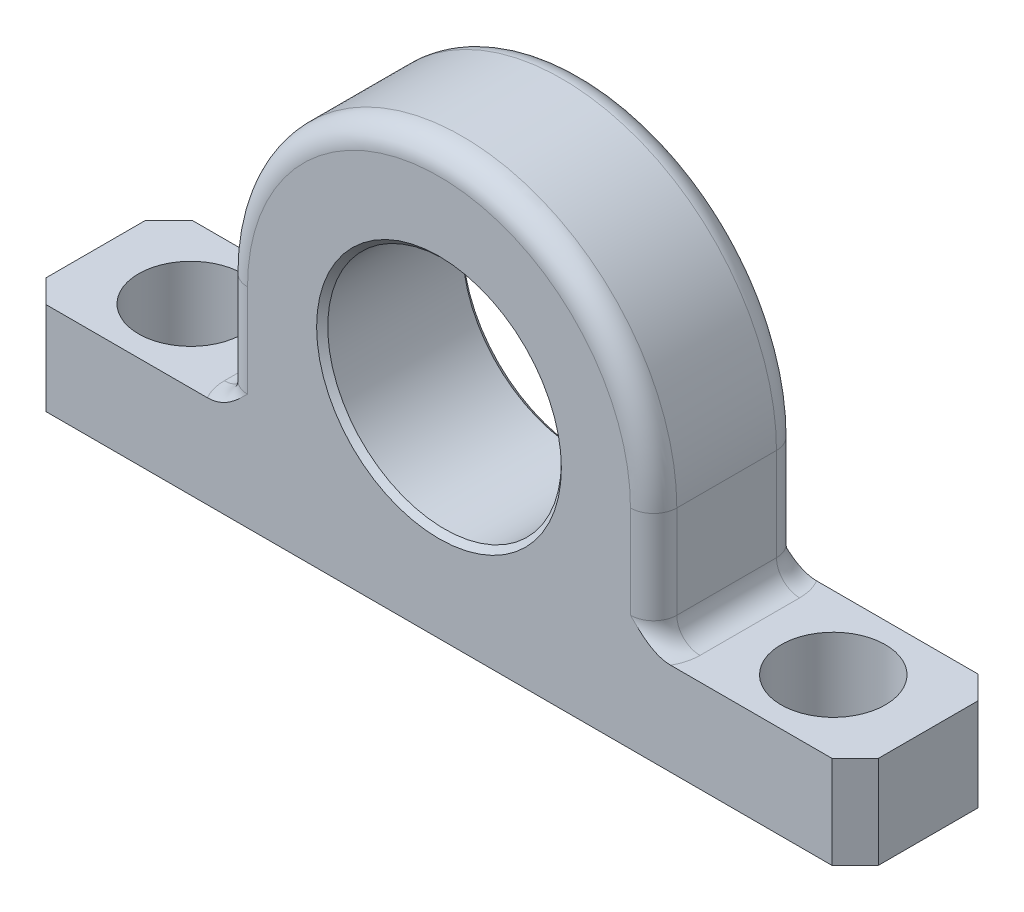
ISO-10303-21;
HEADER;
FILE_DESCRIPTION(('STEP AP214'),'2;1');
FILE_NAME('part.step','',(''),(''),'','','');
FILE_SCHEMA(('AUTOMOTIVE_DESIGN { 1 0 10303 214 1 1 1 1 }'));
ENDSEC;
DATA;
#1=APPLICATION_CONTEXT('core data for automotive mechanical design processes');
#2=APPLICATION_PROTOCOL_DEFINITION('international standard','automotive_design',2000,#1);
#3=PRODUCT_CONTEXT('',#1,'mechanical');
#4=PRODUCT('Part','Part','',(#3));
#5=PRODUCT_RELATED_PRODUCT_CATEGORY('part','',(#4));
#6=PRODUCT_DEFINITION_FORMATION('','',#4);
#7=PRODUCT_DEFINITION_CONTEXT('part definition',#1,'design');
#8=PRODUCT_DEFINITION('design','',#6,#7);
#9=PRODUCT_DEFINITION_SHAPE('','',#8);
#10=(LENGTH_UNIT() NAMED_UNIT(*) SI_UNIT(.MILLI.,.METRE.));
#11=(NAMED_UNIT(*) PLANE_ANGLE_UNIT() SI_UNIT($,.RADIAN.));
#12=(NAMED_UNIT(*) SI_UNIT($,.STERADIAN.) SOLID_ANGLE_UNIT());
#13=UNCERTAINTY_MEASURE_WITH_UNIT(LENGTH_MEASURE(1.E-05),#10,'distance_accuracy_value','');
#14=(GEOMETRIC_REPRESENTATION_CONTEXT(3) GLOBAL_UNCERTAINTY_ASSIGNED_CONTEXT((#13)) GLOBAL_UNIT_ASSIGNED_CONTEXT((#10,
#11,#12)) REPRESENTATION_CONTEXT('',''));
#15=CARTESIAN_POINT('',(0.,0.,0.));
#16=DIRECTION('',(0.,0.,1.));
#17=DIRECTION('',(1.,0.,0.));
#18=AXIS2_PLACEMENT_3D('',#15,#16,#17);
#19=CARTESIAN_POINT('',(0.,14.3,5.));
#20=DIRECTION('',(0.,0.,1.));
#21=DIRECTION('',(1.,0.,0.));
#22=AXIS2_PLACEMENT_3D('',#19,#20,#21);
#23=PLANE('',#22);
#24=CARTESIAN_POINT('',(0.,14.3,5.));
#25=DIRECTION('',(0.,0.,1.));
#26=DIRECTION('',(1.,0.,0.));
#27=AXIS2_PLACEMENT_3D('',#24,#25,#26);
#28=CIRCLE('',#27,8.38100000000001);
#29=CARTESIAN_POINT('',(8.38100000000001,14.3,5.));
#30=VERTEX_POINT('',#29);
#31=EDGE_CURVE('E12',#30,#30,#28,.F.);
#32=ORIENTED_EDGE('',*,*,#31,.T.);
#33=EDGE_LOOP('',(#32));
#34=FACE_BOUND('',#33,.T.);
#35=DIRECTION('',(1.,0.,0.));
#36=VECTOR('',#35,1.);
#37=CARTESIAN_POINT('',(-28.5,0.,5.));
#38=LINE('',#37,#36);
#39=CARTESIAN_POINT('',(-26.9125,0.,5.));
#40=VERTEX_POINT('',#39);
#41=CARTESIAN_POINT('',(26.9125,0.,5.));
#42=VERTEX_POINT('',#41);
#43=EDGE_CURVE('E605',#40,#42,#38,.T.);
#44=ORIENTED_EDGE('',*,*,#43,.T.);
#45=DIRECTION('',(0.,1.,0.));
#46=VECTOR('',#45,1.);
#47=CARTESIAN_POINT('',(26.9125,6.35000000000001,5.));
#48=LINE('',#47,#46);
#49=CARTESIAN_POINT('',(26.9125,6.35000000000001,5.));
#50=VERTEX_POINT('',#49);
#51=EDGE_CURVE('E685',#42,#50,#48,.T.);
#52=ORIENTED_EDGE('',*,*,#51,.T.);
#53=DIRECTION('',(-1.,0.,0.));
#54=VECTOR('',#53,1.);
#55=CARTESIAN_POINT('',(28.5,6.35000000000001,5.));
#56=LINE('',#55,#54);
#57=CARTESIAN_POINT('',(15.8621306570156,6.35,5.));
#58=VERTEX_POINT('',#57);
#59=EDGE_CURVE('E608',#50,#58,#56,.T.);
#60=ORIENTED_EDGE('',*,*,#59,.T.);
#61=CARTESIAN_POINT('',(15.8621306570156,6.35,5.));
#62=CARTESIAN_POINT('',(15.794097486566,6.34999554933561,5.));
#63=CARTESIAN_POINT('',(15.7261228508442,6.35327982071229,5.));
#64=CARTESIAN_POINT('',(15.5908485896682,6.36598925393127,5.));
#65=CARTESIAN_POINT('',(15.5235480949814,6.37540507054521,5.));
#66=CARTESIAN_POINT('',(15.3248608747615,6.41190441990164,5.));
#67=CARTESIAN_POINT('',(15.1949579488796,6.44726316471159,5.));
#68=CARTESIAN_POINT('',(14.8946937292162,6.55304335959927,5.));
#69=CARTESIAN_POINT('',(14.7272685715575,6.63161663326229,5.));
#70=CARTESIAN_POINT('',(14.4061687820012,6.81403388554132,5.));
#71=CARTESIAN_POINT('',(14.2525762438165,6.91801666675492,5.));
#72=CARTESIAN_POINT('',(13.9277540091234,7.1652642515428,5.));
#73=CARTESIAN_POINT('',(13.7594109868458,7.31220837636742,5.));
#74=CARTESIAN_POINT('',(13.4334074538243,7.61671176311661,5.));
#75=CARTESIAN_POINT('',(13.2757387302991,7.77426267368925,5.));
#76=CARTESIAN_POINT('',(13.1162564755506,7.93374352567541,5.));
#77=CARTESIAN_POINT('',(13.1143782375845,7.93562176365669,5.));
#78=CARTESIAN_POINT('',(13.1125,7.93750000000001,5.));
#79=B_SPLINE_CURVE_WITH_KNOTS('',3,(#61,#62,#63,#64,#65,#66,#67,#68,#69,#70,#71,#72,#73,#74,#75,
#76,#77,#78),.UNSPECIFIED.,.F.,.F.,(4,2,2,2,2,2,2,2,4),(0.,0.20392435013509,0.407538619655304,
0.809647512230969,1.36141360837506,1.91626395535248,2.58543870518178,3.25409260056162,
3.26206128928693),.UNSPECIFIED.);
#80=CARTESIAN_POINT('',(13.1125,7.93750000000001,5.));
#81=VERTEX_POINT('',#80);
#82=EDGE_CURVE('E313',#58,#81,#79,.T.);
#83=ORIENTED_EDGE('',*,*,#82,.T.);
#84=DIRECTION('',(0.,1.,0.));
#85=VECTOR('',#84,1.);
#86=CARTESIAN_POINT('',(13.1125,14.3,5.));
#87=LINE('',#86,#85);
#88=CARTESIAN_POINT('',(13.1125,14.3,5.));
#89=VERTEX_POINT('',#88);
#90=EDGE_CURVE('E273',#81,#89,#87,.T.);
#91=ORIENTED_EDGE('',*,*,#90,.T.);
#92=CARTESIAN_POINT('',(0.,14.3,5.));
#93=DIRECTION('',(0.,0.,1.));
#94=DIRECTION('',(1.,0.,0.));
#95=AXIS2_PLACEMENT_3D('',#92,#93,#94);
#96=CIRCLE('',#95,13.1125);
#97=CARTESIAN_POINT('',(-13.1125,14.3,5.));
#98=VERTEX_POINT('',#97);
#99=EDGE_CURVE('E271',#89,#98,#96,.T.);
#100=ORIENTED_EDGE('',*,*,#99,.T.);
#101=DIRECTION('',(0.,-1.,0.));
#102=VECTOR('',#101,1.);
#103=CARTESIAN_POINT('',(-13.1125,6.35,5.));
#104=LINE('',#103,#102);
#105=CARTESIAN_POINT('',(-13.1125,7.9375,5.));
#106=VERTEX_POINT('',#105);
#107=EDGE_CURVE('E254',#98,#106,#104,.T.);
#108=ORIENTED_EDGE('',*,*,#107,.T.);
#109=CARTESIAN_POINT('',(-15.8621306570156,6.35,5.));
#110=CARTESIAN_POINT('',(-15.794097486566,6.3499955493356,5.));
#111=CARTESIAN_POINT('',(-15.7261228508442,6.35327982071229,5.));
#112=CARTESIAN_POINT('',(-15.5908485896682,6.36598925393126,5.));
#113=CARTESIAN_POINT('',(-15.5235480949814,6.3754050705452,5.));
#114=CARTESIAN_POINT('',(-15.3248608747615,6.41190441990164,5.));
#115=CARTESIAN_POINT('',(-15.1949579488796,6.44726316471159,5.));
#116=CARTESIAN_POINT('',(-14.8946937292162,6.55304335959926,5.));
#117=CARTESIAN_POINT('',(-14.7272685715575,6.63161663326228,5.));
#118=CARTESIAN_POINT('',(-14.4061687820012,6.81403388554132,5.));
#119=CARTESIAN_POINT('',(-14.2525762438165,6.91801666675491,5.));
#120=CARTESIAN_POINT('',(-13.9277540091234,7.1652642515428,5.));
#121=CARTESIAN_POINT('',(-13.7594109868458,7.31220837636741,5.));
#122=CARTESIAN_POINT('',(-13.4334074538243,7.6167117631166,5.));
#123=CARTESIAN_POINT('',(-13.2757387302991,7.77426267368925,5.));
#124=CARTESIAN_POINT('',(-13.1162564755506,7.9337435256754,5.));
#125=CARTESIAN_POINT('',(-13.1143782375845,7.93562176365669,5.));
#126=CARTESIAN_POINT('',(-13.1125,7.9375,5.));
#127=B_SPLINE_CURVE_WITH_KNOTS('',3,(#109,#110,#111,#112,#113,#114,#115,#116,#117,#118,#119,
#120,#121,#122,#123,#124,#125,#126),.UNSPECIFIED.,.F.,.F.,(4,2,2,2,2,2,2,2,4),(0.,
0.203924350135094,0.407538619655304,0.809647512230969,1.36141360837506,1.91626395535248,
2.58543870518178,3.25409260056162,3.26206128928693),.UNSPECIFIED.);
#128=CARTESIAN_POINT('',(-15.8621306570156,6.35,5.));
#129=VERTEX_POINT('',#128);
#130=EDGE_CURVE('E341',#106,#129,#127,.F.);
#131=ORIENTED_EDGE('',*,*,#130,.T.);
#132=DIRECTION('',(-1.,0.,0.));
#133=VECTOR('',#132,1.);
#134=CARTESIAN_POINT('',(-28.5,6.35,5.));
#135=LINE('',#134,#133);
#136=CARTESIAN_POINT('',(-26.9125,6.35,5.));
#137=VERTEX_POINT('',#136);
#138=EDGE_CURVE('E611',#129,#137,#135,.T.);
#139=ORIENTED_EDGE('',*,*,#138,.T.);
#140=DIRECTION('',(0.,-1.,0.));
#141=VECTOR('',#140,1.);
#142=CARTESIAN_POINT('',(-26.9125,0.,5.));
#143=LINE('',#142,#141);
#144=EDGE_CURVE('E682',#137,#40,#143,.T.);
#145=ORIENTED_EDGE('',*,*,#144,.T.);
#146=EDGE_LOOP('',(#44,#52,#60,#83,#91,#100,#108,#131,#139,#145));
#147=FACE_BOUND('',#146,.T.);
#148=ADVANCED_FACE('F85',(#34,#147),#23,.T.);
#149=CARTESIAN_POINT('',(0.,14.3,-5.));
#150=DIRECTION('',(0.,0.,1.));
#151=DIRECTION('',(1.,0.,0.));
#152=AXIS2_PLACEMENT_3D('',#149,#150,#151);
#153=PLANE('',#152);
#154=CARTESIAN_POINT('',(0.,14.3,-5.));
#155=DIRECTION('',(0.,0.,1.));
#156=DIRECTION('',(1.,0.,0.));
#157=AXIS2_PLACEMENT_3D('',#154,#155,#156);
#158=CIRCLE('',#157,8.38099999999999);
#159=CARTESIAN_POINT('',(8.38099999999999,14.3,-5.));
#160=VERTEX_POINT('',#159);
#161=EDGE_CURVE('E396',#160,#160,#158,.T.);
#162=ORIENTED_EDGE('',*,*,#161,.T.);
#163=EDGE_LOOP('',(#162));
#164=FACE_BOUND('',#163,.T.);
#165=DIRECTION('',(-1.,0.,0.));
#166=VECTOR('',#165,1.);
#167=CARTESIAN_POINT('',(28.5,6.35000000000001,-5.));
#168=LINE('',#167,#166);
#169=CARTESIAN_POINT('',(26.9125,6.35000000000001,-5.));
#170=VERTEX_POINT('',#169);
#171=CARTESIAN_POINT('',(15.8621306570156,6.35,-5.));
#172=VERTEX_POINT('',#171);
#173=EDGE_CURVE('E617',#170,#172,#168,.T.);
#174=ORIENTED_EDGE('',*,*,#173,.F.);
#175=DIRECTION('',(0.,-1.,0.));
#176=VECTOR('',#175,1.);
#177=CARTESIAN_POINT('',(26.9125,14.3,-5.));
#178=LINE('',#177,#176);
#179=CARTESIAN_POINT('',(26.9125,0.,-5.));
#180=VERTEX_POINT('',#179);
#181=EDGE_CURVE('E672',#170,#180,#178,.T.);
#182=ORIENTED_EDGE('',*,*,#181,.T.);
#183=DIRECTION('',(1.,0.,0.));
#184=VECTOR('',#183,1.);
#185=CARTESIAN_POINT('',(-28.5,0.,-5.));
#186=LINE('',#185,#184);
#187=CARTESIAN_POINT('',(-26.9125,0.,-5.));
#188=VERTEX_POINT('',#187);
#189=EDGE_CURVE('E286',#188,#180,#186,.T.);
#190=ORIENTED_EDGE('',*,*,#189,.F.);
#191=DIRECTION('',(0.,1.,0.));
#192=VECTOR('',#191,1.);
#193=CARTESIAN_POINT('',(-26.9125,14.3,-5.));
#194=LINE('',#193,#192);
#195=CARTESIAN_POINT('',(-26.9125,6.35,-5.));
#196=VERTEX_POINT('',#195);
#197=EDGE_CURVE('E670',#188,#196,#194,.T.);
#198=ORIENTED_EDGE('',*,*,#197,.T.);
#199=DIRECTION('',(-1.,0.,0.));
#200=VECTOR('',#199,1.);
#201=CARTESIAN_POINT('',(-28.5,6.35,-5.));
#202=LINE('',#201,#200);
#203=CARTESIAN_POINT('',(-15.8621306570156,6.35,-5.));
#204=VERTEX_POINT('',#203);
#205=EDGE_CURVE('E609',#204,#196,#202,.T.);
#206=ORIENTED_EDGE('',*,*,#205,.F.);
#207=CARTESIAN_POINT('',(-15.8621306570156,6.35,-5.));
#208=CARTESIAN_POINT('',(-15.7940974865659,6.3499955493356,-5.));
#209=CARTESIAN_POINT('',(-15.7261228508441,6.35327982071229,-5.));
#210=CARTESIAN_POINT('',(-15.590848589668,6.36598925393128,-5.));
#211=CARTESIAN_POINT('',(-15.5235480949812,6.37540507054523,-5.));
#212=CARTESIAN_POINT('',(-15.3248608747613,6.41190441990168,-5.));
#213=CARTESIAN_POINT('',(-15.1949579488795,6.44726316471161,-5.));
#214=CARTESIAN_POINT('',(-14.8946937292162,6.55304335959925,-5.));
#215=CARTESIAN_POINT('',(-14.7272685715576,6.63161663326226,-5.));
#216=CARTESIAN_POINT('',(-14.4061687820012,6.81403388554121,-5.));
#217=CARTESIAN_POINT('',(-14.2525762438164,6.91801666675475,-5.));
#218=CARTESIAN_POINT('',(-13.9277540091235,7.16526425154297,-5.));
#219=CARTESIAN_POINT('',(-13.7594109868463,7.31220837636808,-5.));
#220=CARTESIAN_POINT('',(-13.4334074538236,7.61671176311603,-5.));
#221=CARTESIAN_POINT('',(-13.2757387302968,7.77426267368695,-5.));
#222=CARTESIAN_POINT('',(-13.1162564755505,7.93374352567535,-5.));
#223=CARTESIAN_POINT('',(-13.1143782375845,7.93562176365666,-5.));
#224=CARTESIAN_POINT('',(-13.1125,7.9375,-5.));
#225=B_SPLINE_CURVE_WITH_KNOTS('',3,(#207,#208,#209,#210,#211,#212,#213,#214,#215,#216,#217,
#218,#219,#220,#221,#222,#223,#224),.UNSPECIFIED.,.F.,.F.,(4,2,2,2,2,2,2,2,4),(0.,
0.203924350135216,0.407538619655549,0.80964751223097,1.36141360837487,1.91626395535248,
2.58543870518189,3.25409260056162,3.26206128928693),.UNSPECIFIED.);
#226=CARTESIAN_POINT('',(-13.1125,7.9375,-5.));
#227=VERTEX_POINT('',#226);
#228=EDGE_CURVE('E347',#204,#227,#225,.T.);
#229=ORIENTED_EDGE('',*,*,#228,.T.);
#230=DIRECTION('',(0.,-1.,0.));
#231=VECTOR('',#230,1.);
#232=CARTESIAN_POINT('',(-13.1125,14.3,-5.));
#233=LINE('',#232,#231);
#234=CARTESIAN_POINT('',(-13.1125,14.3,-5.));
#235=VERTEX_POINT('',#234);
#236=EDGE_CURVE('E263',#227,#235,#233,.F.);
#237=ORIENTED_EDGE('',*,*,#236,.T.);
#238=CARTESIAN_POINT('',(0.,14.3,-5.));
#239=DIRECTION('',(0.,0.,1.));
#240=DIRECTION('',(1.,0.,0.));
#241=AXIS2_PLACEMENT_3D('',#238,#239,#240);
#242=CIRCLE('',#241,13.1125);
#243=CARTESIAN_POINT('',(13.1125,14.3,-5.));
#244=VERTEX_POINT('',#243);
#245=EDGE_CURVE('E266',#235,#244,#242,.F.);
#246=ORIENTED_EDGE('',*,*,#245,.T.);
#247=DIRECTION('',(0.,1.,0.));
#248=VECTOR('',#247,1.);
#249=CARTESIAN_POINT('',(13.1125,14.3,-5.));
#250=LINE('',#249,#248);
#251=CARTESIAN_POINT('',(13.1125,7.93750000000001,-5.));
#252=VERTEX_POINT('',#251);
#253=EDGE_CURVE('E630',#244,#252,#250,.F.);
#254=ORIENTED_EDGE('',*,*,#253,.T.);
#255=CARTESIAN_POINT('',(15.8621306570156,6.35,-5.));
#256=CARTESIAN_POINT('',(15.7940974865659,6.3499955493356,-5.));
#257=CARTESIAN_POINT('',(15.7261228508441,6.35327982071229,-5.));
#258=CARTESIAN_POINT('',(15.590848589668,6.36598925393129,-5.));
#259=CARTESIAN_POINT('',(15.5235480949812,6.37540507054524,-5.));
#260=CARTESIAN_POINT('',(15.3248608747613,6.41190441990168,-5.));
#261=CARTESIAN_POINT('',(15.1949579488795,6.44726316471161,-5.));
#262=CARTESIAN_POINT('',(14.8946937292162,6.55304335959925,-5.));
#263=CARTESIAN_POINT('',(14.7272685715576,6.63161663326226,-5.));
#264=CARTESIAN_POINT('',(14.4061687820012,6.81403388554122,-5.));
#265=CARTESIAN_POINT('',(14.2525762438164,6.91801666675475,-5.));
#266=CARTESIAN_POINT('',(13.9277540091235,7.16526425154297,-5.));
#267=CARTESIAN_POINT('',(13.7594109868463,7.31220837636808,-5.));
#268=CARTESIAN_POINT('',(13.4334074538236,7.61671176311604,-5.));
#269=CARTESIAN_POINT('',(13.2757387302968,7.77426267368696,-5.));
#270=CARTESIAN_POINT('',(13.1162564755505,7.93374352567535,-5.));
#271=CARTESIAN_POINT('',(13.1143782375845,7.93562176365667,-5.));
#272=CARTESIAN_POINT('',(13.1125,7.93750000000001,-5.));
#273=B_SPLINE_CURVE_WITH_KNOTS('',3,(#255,#256,#257,#258,#259,#260,#261,#262,#263,#264,#265,
#266,#267,#268,#269,#270,#271,#272),.UNSPECIFIED.,.F.,.F.,(4,2,2,2,2,2,2,2,4),(0.,
0.203924350135212,0.407538619655549,0.80964751223097,1.36141360837487,1.91626395535248,
2.58543870518189,3.25409260056162,3.26206128928693),.UNSPECIFIED.);
#274=EDGE_CURVE('E320',#252,#172,#273,.F.);
#275=ORIENTED_EDGE('',*,*,#274,.T.);
#276=EDGE_LOOP('',(#174,#182,#190,#198,#206,#229,#237,#246,#254,#275));
#277=FACE_BOUND('',#276,.T.);
#278=ADVANCED_FACE('F334',(#164,#277),#153,.F.);
#279=CARTESIAN_POINT('',(-28.5,0.,5.));
#280=DIRECTION('',(0.,1.,0.));
#281=DIRECTION('',(-1.,0.,0.));
#282=AXIS2_PLACEMENT_3D('',#279,#280,#281);
#283=PLANE('',#282);
#284=CARTESIAN_POINT('',(-22.,0.,0.));
#285=DIRECTION('',(0.,1.,0.));
#286=DIRECTION('',(-1.,0.,0.));
#287=AXIS2_PLACEMENT_3D('',#284,#285,#286);
#288=CIRCLE('',#287,3.571875);
#289=CARTESIAN_POINT('',(-25.571875,0.,0.));
#290=VERTEX_POINT('',#289);
#291=EDGE_CURVE('E655',#290,#290,#288,.T.);
#292=ORIENTED_EDGE('',*,*,#291,.T.);
#293=EDGE_LOOP('',(#292));
#294=FACE_BOUND('',#293,.T.);
#295=CARTESIAN_POINT('',(22.,0.,0.));
#296=DIRECTION('',(0.,1.,0.));
#297=DIRECTION('',(1.,0.,0.));
#298=AXIS2_PLACEMENT_3D('',#295,#296,#297);
#299=CIRCLE('',#298,3.571875);
#300=CARTESIAN_POINT('',(25.571875,0.,0.));
#301=VERTEX_POINT('',#300);
#302=EDGE_CURVE('E596',#301,#301,#299,.T.);
#303=ORIENTED_EDGE('',*,*,#302,.T.);
#304=EDGE_LOOP('',(#303));
#305=FACE_BOUND('',#304,.T.);
#306=ORIENTED_EDGE('',*,*,#189,.T.);
#307=DIRECTION('',(-0.707106781186549,0.,-0.707106781186546));
#308=VECTOR('',#307,1.);
#309=CARTESIAN_POINT('',(28.5,0.,-3.41250000000001));
#310=LINE('',#309,#308);
#311=CARTESIAN_POINT('',(28.5,0.,-3.41250000000001));
#312=VERTEX_POINT('',#311);
#313=EDGE_CURVE('E680',#180,#312,#310,.F.);
#314=ORIENTED_EDGE('',*,*,#313,.T.);
#315=DIRECTION('',(0.,0.,-1.));
#316=VECTOR('',#315,1.);
#317=CARTESIAN_POINT('',(28.5,0.,5.));
#318=LINE('',#317,#316);
#319=CARTESIAN_POINT('',(28.5,0.,3.41249999999999));
#320=VERTEX_POINT('',#319);
#321=EDGE_CURVE('E236',#320,#312,#318,.T.);
#322=ORIENTED_EDGE('',*,*,#321,.F.);
#323=DIRECTION('',(-0.707106781186546,0.,0.707106781186549));
#324=VECTOR('',#323,1.);
#325=CARTESIAN_POINT('',(26.9125,0.,5.));
#326=LINE('',#325,#324);
#327=EDGE_CURVE('E678',#320,#42,#326,.T.);
#328=ORIENTED_EDGE('',*,*,#327,.T.);
#329=ORIENTED_EDGE('',*,*,#43,.F.);
#330=DIRECTION('',(-0.707106781186546,0.,-0.707106781186549));
#331=VECTOR('',#330,1.);
#332=CARTESIAN_POINT('',(-26.9125,0.,5.));
#333=LINE('',#332,#331);
#334=CARTESIAN_POINT('',(-28.5,0.,3.41249999999999));
#335=VERTEX_POINT('',#334);
#336=EDGE_CURVE('E674',#40,#335,#333,.T.);
#337=ORIENTED_EDGE('',*,*,#336,.T.);
#338=DIRECTION('',(0.,0.,-1.));
#339=VECTOR('',#338,1.);
#340=CARTESIAN_POINT('',(-28.5,0.,5.));
#341=LINE('',#340,#339);
#342=CARTESIAN_POINT('',(-28.5,0.,-3.41250000000001));
#343=VERTEX_POINT('',#342);
#344=EDGE_CURVE('E614',#335,#343,#341,.T.);
#345=ORIENTED_EDGE('',*,*,#344,.T.);
#346=DIRECTION('',(-0.707106781186549,0.,0.707106781186546));
#347=VECTOR('',#346,1.);
#348=CARTESIAN_POINT('',(-28.5,0.,-3.41250000000001));
#349=LINE('',#348,#347);
#350=EDGE_CURVE('E676',#343,#188,#349,.F.);
#351=ORIENTED_EDGE('',*,*,#350,.T.);
#352=EDGE_LOOP('',(#306,#314,#322,#328,#329,#337,#345,#351));
#353=FACE_BOUND('',#352,.T.);
#354=ADVANCED_FACE('F441',(#294,#305,#353),#283,.F.);
#355=CARTESIAN_POINT('',(28.5,0.,5.));
#356=DIRECTION('',(-1.,0.,0.));
#357=DIRECTION('',(0.,0.,1.));
#358=AXIS2_PLACEMENT_3D('',#355,#356,#357);
#359=PLANE('',#358);
#360=ORIENTED_EDGE('',*,*,#321,.T.);
#361=DIRECTION('',(0.,1.,0.));
#362=VECTOR('',#361,1.);
#363=CARTESIAN_POINT('',(28.5,0.,-3.41250000000001));
#364=LINE('',#363,#362);
#365=CARTESIAN_POINT('',(28.5,6.35000000000001,-3.41250000000001));
#366=VERTEX_POINT('',#365);
#367=EDGE_CURVE('E663',#312,#366,#364,.T.);
#368=ORIENTED_EDGE('',*,*,#367,.T.);
#369=DIRECTION('',(0.,0.,-1.));
#370=VECTOR('',#369,1.);
#371=CARTESIAN_POINT('',(28.5,6.35000000000001,5.));
#372=LINE('',#371,#370);
#373=CARTESIAN_POINT('',(28.5,6.35000000000001,3.41249999999999));
#374=VERTEX_POINT('',#373);
#375=EDGE_CURVE('E624',#374,#366,#372,.T.);
#376=ORIENTED_EDGE('',*,*,#375,.F.);
#377=DIRECTION('',(0.,-1.,0.));
#378=VECTOR('',#377,1.);
#379=CARTESIAN_POINT('',(28.5,0.,3.41249999999999));
#380=LINE('',#379,#378);
#381=EDGE_CURVE('E661',#374,#320,#380,.T.);
#382=ORIENTED_EDGE('',*,*,#381,.T.);
#383=EDGE_LOOP('',(#360,#368,#376,#382));
#384=FACE_BOUND('',#383,.T.);
#385=ADVANCED_FACE('F437',(#384),#359,.F.);
#386=CARTESIAN_POINT('',(28.5,6.35000000000001,5.));
#387=DIRECTION('',(0.,-1.,0.));
#388=DIRECTION('',(1.,0.,0.));
#389=AXIS2_PLACEMENT_3D('',#386,#387,#388);
#390=PLANE('',#389);
#391=CARTESIAN_POINT('',(22.,6.35000000000001,0.));
#392=DIRECTION('',(0.,1.,0.));
#393=DIRECTION('',(1.,0.,0.));
#394=AXIS2_PLACEMENT_3D('',#391,#392,#393);
#395=CIRCLE('',#394,3.571875);
#396=CARTESIAN_POINT('',(25.571875,6.35000000000001,0.));
#397=VERTEX_POINT('',#396);
#398=EDGE_CURVE('E599',#397,#397,#395,.T.);
#399=ORIENTED_EDGE('',*,*,#398,.F.);
#400=EDGE_LOOP('',(#399));
#401=FACE_BOUND('',#400,.T.);
#402=ORIENTED_EDGE('',*,*,#375,.T.);
#403=DIRECTION('',(0.707106781186549,0.,0.707106781186546));
#404=VECTOR('',#403,1.);
#405=CARTESIAN_POINT('',(28.5,6.35000000000001,-3.41250000000001));
#406=LINE('',#405,#404);
#407=EDGE_CURVE('E668',#366,#170,#406,.F.);
#408=ORIENTED_EDGE('',*,*,#407,.T.);
#409=ORIENTED_EDGE('',*,*,#173,.T.);
#410=CARTESIAN_POINT('',(13.1125,6.35,-3.4125));
#411=DIRECTION('',(0.,-1.,0.));
#412=DIRECTION('',(1.,0.,0.));
#413=AXIS2_PLACEMENT_3D('',#410,#411,#412);
#414=CIRCLE('',#413,3.175);
#415=CARTESIAN_POINT('',(16.2875,6.35,-3.4125));
#416=VERTEX_POINT('',#415);
#417=EDGE_CURVE('E290',#172,#416,#414,.T.);
#418=ORIENTED_EDGE('',*,*,#417,.T.);
#419=DIRECTION('',(0.,0.,-1.));
#420=VECTOR('',#419,1.);
#421=CARTESIAN_POINT('',(16.2875,6.35,3.4125));
#422=LINE('',#421,#420);
#423=CARTESIAN_POINT('',(16.2875,6.35,3.4125));
#424=VERTEX_POINT('',#423);
#425=EDGE_CURVE('E280',#416,#424,#422,.F.);
#426=ORIENTED_EDGE('',*,*,#425,.T.);
#427=CARTESIAN_POINT('',(13.1125,6.35,3.4125));
#428=DIRECTION('',(0.,-1.,0.));
#429=DIRECTION('',(1.,0.,0.));
#430=AXIS2_PLACEMENT_3D('',#427,#428,#429);
#431=CIRCLE('',#430,3.175);
#432=EDGE_CURVE('E292',#424,#58,#431,.T.);
#433=ORIENTED_EDGE('',*,*,#432,.T.);
#434=ORIENTED_EDGE('',*,*,#59,.F.);
#435=DIRECTION('',(0.707106781186546,0.,-0.707106781186549));
#436=VECTOR('',#435,1.);
#437=CARTESIAN_POINT('',(26.9125,6.35000000000001,5.));
#438=LINE('',#437,#436);
#439=EDGE_CURVE('E666',#50,#374,#438,.T.);
#440=ORIENTED_EDGE('',*,*,#439,.T.);
#441=EDGE_LOOP('',(#402,#408,#409,#418,#426,#433,#434,#440));
#442=FACE_BOUND('',#441,.T.);
#443=ADVANCED_FACE('F433',(#401,#442),#390,.F.);
#444=CARTESIAN_POINT('',(14.7,6.35,5.));
#445=DIRECTION('',(-1.,0.,0.));
#446=DIRECTION('',(0.,-1.,0.));
#447=AXIS2_PLACEMENT_3D('',#444,#445,#446);
#448=PLANE('',#447);
#449=DIRECTION('',(0.,1.,0.));
#450=VECTOR('',#449,1.);
#451=CARTESIAN_POINT('',(14.7,6.35000000000001,3.4125));
#452=LINE('',#451,#450);
#453=CARTESIAN_POINT('',(14.7,14.3,3.4125));
#454=VERTEX_POINT('',#453);
#455=CARTESIAN_POINT('',(14.7,7.93750000000001,3.4125));
#456=VERTEX_POINT('',#455);
#457=EDGE_CURVE('E277',#454,#456,#452,.F.);
#458=ORIENTED_EDGE('',*,*,#457,.T.);
#459=DIRECTION('',(0.,0.,-1.));
#460=VECTOR('',#459,1.);
#461=CARTESIAN_POINT('',(14.7,7.93750000000001,-3.4125));
#462=LINE('',#461,#460);
#463=CARTESIAN_POINT('',(14.7,7.93750000000001,-3.4125));
#464=VERTEX_POINT('',#463);
#465=EDGE_CURVE('E310',#456,#464,#462,.T.);
#466=ORIENTED_EDGE('',*,*,#465,.T.);
#467=DIRECTION('',(0.,1.,0.));
#468=VECTOR('',#467,1.);
#469=CARTESIAN_POINT('',(14.7,6.35,-3.4125));
#470=LINE('',#469,#468);
#471=CARTESIAN_POINT('',(14.7,14.3,-3.4125));
#472=VERTEX_POINT('',#471);
#473=EDGE_CURVE('E275',#464,#472,#470,.T.);
#474=ORIENTED_EDGE('',*,*,#473,.T.);
#475=DIRECTION('',(0.,0.,-1.));
#476=VECTOR('',#475,1.);
#477=CARTESIAN_POINT('',(14.7,14.3,5.));
#478=LINE('',#477,#476);
#479=EDGE_CURVE('E246',#454,#472,#478,.T.);
#480=ORIENTED_EDGE('',*,*,#479,.F.);
#481=EDGE_LOOP('',(#458,#466,#474,#480));
#482=FACE_BOUND('',#481,.T.);
#483=ADVANCED_FACE('F430',(#482),#448,.F.);
#484=CARTESIAN_POINT('',(0.,14.3,5.));
#485=DIRECTION('',(0.,0.,-1.));
#486=DIRECTION('',(-1.,0.,0.));
#487=AXIS2_PLACEMENT_3D('',#484,#485,#486);
#488=CYLINDRICAL_SURFACE('',#487,14.7);
#489=ORIENTED_EDGE('',*,*,#479,.T.);
#490=CARTESIAN_POINT('',(0.,14.3,-3.4125));
#491=DIRECTION('',(0.,0.,1.));
#492=DIRECTION('',(1.,0.,0.));
#493=AXIS2_PLACEMENT_3D('',#490,#491,#492);
#494=CIRCLE('',#493,14.7);
#495=CARTESIAN_POINT('',(-14.7,14.3,-3.4125));
#496=VERTEX_POINT('',#495);
#497=EDGE_CURVE('E245',#472,#496,#494,.T.);
#498=ORIENTED_EDGE('',*,*,#497,.T.);
#499=DIRECTION('',(0.,0.,-1.));
#500=VECTOR('',#499,1.);
#501=CARTESIAN_POINT('',(-14.7,14.3,5.));
#502=LINE('',#501,#500);
#503=CARTESIAN_POINT('',(-14.7,14.3,3.4125));
#504=VERTEX_POINT('',#503);
#505=EDGE_CURVE('E228',#504,#496,#502,.T.);
#506=ORIENTED_EDGE('',*,*,#505,.F.);
#507=CARTESIAN_POINT('',(0.,14.3,3.4125));
#508=DIRECTION('',(0.,0.,1.));
#509=DIRECTION('',(1.,0.,0.));
#510=AXIS2_PLACEMENT_3D('',#507,#508,#509);
#511=CIRCLE('',#510,14.7);
#512=EDGE_CURVE('E242',#504,#454,#511,.F.);
#513=ORIENTED_EDGE('',*,*,#512,.T.);
#514=EDGE_LOOP('',(#489,#498,#506,#513));
#515=FACE_BOUND('',#514,.T.);
#516=ADVANCED_FACE('F240',(#515),#488,.T.);
#517=CARTESIAN_POINT('',(-14.7,6.35,5.));
#518=DIRECTION('',(1.,0.,0.));
#519=DIRECTION('',(0.,1.,0.));
#520=AXIS2_PLACEMENT_3D('',#517,#518,#519);
#521=PLANE('',#520);
#522=DIRECTION('',(0.,-1.,0.));
#523=VECTOR('',#522,1.);
#524=CARTESIAN_POINT('',(-14.7,6.35,-3.4125));
#525=LINE('',#524,#523);
#526=CARTESIAN_POINT('',(-14.7,7.9375,-3.4125));
#527=VERTEX_POINT('',#526);
#528=EDGE_CURVE('E235',#496,#527,#525,.T.);
#529=ORIENTED_EDGE('',*,*,#528,.T.);
#530=DIRECTION('',(0.,0.,-1.));
#531=VECTOR('',#530,1.);
#532=CARTESIAN_POINT('',(-14.7,7.9375,3.4125));
#533=LINE('',#532,#531);
#534=CARTESIAN_POINT('',(-14.7,7.9375,3.4125));
#535=VERTEX_POINT('',#534);
#536=EDGE_CURVE('E231',#527,#535,#533,.F.);
#537=ORIENTED_EDGE('',*,*,#536,.T.);
#538=DIRECTION('',(0.,-1.,0.));
#539=VECTOR('',#538,1.);
#540=CARTESIAN_POINT('',(-14.7,14.3,3.4125));
#541=LINE('',#540,#539);
#542=EDGE_CURVE('E224',#535,#504,#541,.F.);
#543=ORIENTED_EDGE('',*,*,#542,.T.);
#544=ORIENTED_EDGE('',*,*,#505,.T.);
#545=EDGE_LOOP('',(#529,#537,#543,#544));
#546=FACE_BOUND('',#545,.T.);
#547=ADVANCED_FACE('F227',(#546),#521,.F.);
#548=CARTESIAN_POINT('',(-28.5,6.35,5.));
#549=DIRECTION('',(0.,-1.,0.));
#550=DIRECTION('',(1.,0.,0.));
#551=AXIS2_PLACEMENT_3D('',#548,#549,#550);
#552=PLANE('',#551);
#553=CARTESIAN_POINT('',(-22.,6.35,0.));
#554=DIRECTION('',(0.,1.,0.));
#555=DIRECTION('',(-1.,0.,0.));
#556=AXIS2_PLACEMENT_3D('',#553,#554,#555);
#557=CIRCLE('',#556,3.571875);
#558=CARTESIAN_POINT('',(-25.571875,6.35,0.));
#559=VERTEX_POINT('',#558);
#560=EDGE_CURVE('E601',#559,#559,#557,.T.);
#561=ORIENTED_EDGE('',*,*,#560,.F.);
#562=EDGE_LOOP('',(#561));
#563=FACE_BOUND('',#562,.T.);
#564=ORIENTED_EDGE('',*,*,#205,.T.);
#565=DIRECTION('',(0.707106781186549,0.,-0.707106781186546));
#566=VECTOR('',#565,1.);
#567=CARTESIAN_POINT('',(-28.5,6.35,-3.41250000000001));
#568=LINE('',#567,#566);
#569=CARTESIAN_POINT('',(-28.5,6.35,-3.41250000000001));
#570=VERTEX_POINT('',#569);
#571=EDGE_CURVE('E100',#196,#570,#568,.F.);
#572=ORIENTED_EDGE('',*,*,#571,.T.);
#573=DIRECTION('',(0.,0.,-1.));
#574=VECTOR('',#573,1.);
#575=CARTESIAN_POINT('',(-28.5,6.35,5.));
#576=LINE('',#575,#574);
#577=CARTESIAN_POINT('',(-28.5,6.35,3.41249999999999));
#578=VERTEX_POINT('',#577);
#579=EDGE_CURVE('E247',#578,#570,#576,.T.);
#580=ORIENTED_EDGE('',*,*,#579,.F.);
#581=DIRECTION('',(0.707106781186546,0.,0.707106781186549));
#582=VECTOR('',#581,1.);
#583=CARTESIAN_POINT('',(-26.9125,6.35,5.));
#584=LINE('',#583,#582);
#585=EDGE_CURVE('E402',#578,#137,#584,.T.);
#586=ORIENTED_EDGE('',*,*,#585,.T.);
#587=ORIENTED_EDGE('',*,*,#138,.F.);
#588=CARTESIAN_POINT('',(-13.1125,6.35,3.4125));
#589=DIRECTION('',(0.,-1.,0.));
#590=DIRECTION('',(1.,0.,0.));
#591=AXIS2_PLACEMENT_3D('',#588,#589,#590);
#592=CIRCLE('',#591,3.175);
#593=CARTESIAN_POINT('',(-16.2875,6.35,3.4125));
#594=VERTEX_POINT('',#593);
#595=EDGE_CURVE('E303',#129,#594,#592,.T.);
#596=ORIENTED_EDGE('',*,*,#595,.T.);
#597=DIRECTION('',(0.,0.,-1.));
#598=VECTOR('',#597,1.);
#599=CARTESIAN_POINT('',(-16.2875,6.35,-3.4125));
#600=LINE('',#599,#598);
#601=CARTESIAN_POINT('',(-16.2875,6.35,-3.4125));
#602=VERTEX_POINT('',#601);
#603=EDGE_CURVE('E299',#594,#602,#600,.T.);
#604=ORIENTED_EDGE('',*,*,#603,.T.);
#605=CARTESIAN_POINT('',(-13.1125,6.35,-3.4125));
#606=DIRECTION('',(0.,-1.,0.));
#607=DIRECTION('',(1.,0.,0.));
#608=AXIS2_PLACEMENT_3D('',#605,#606,#607);
#609=CIRCLE('',#608,3.175);
#610=EDGE_CURVE('E301',#602,#204,#609,.T.);
#611=ORIENTED_EDGE('',*,*,#610,.T.);
#612=EDGE_LOOP('',(#564,#572,#580,#586,#587,#596,#604,#611));
#613=FACE_BOUND('',#612,.T.);
#614=ADVANCED_FACE('F419',(#563,#613),#552,.F.);
#615=CARTESIAN_POINT('',(-28.5,0.,5.));
#616=DIRECTION('',(1.,0.,0.));
#617=DIRECTION('',(0.,0.,-1.));
#618=AXIS2_PLACEMENT_3D('',#615,#616,#617);
#619=PLANE('',#618);
#620=ORIENTED_EDGE('',*,*,#579,.T.);
#621=DIRECTION('',(0.,-1.,0.));
#622=VECTOR('',#621,1.);
#623=CARTESIAN_POINT('',(-28.5,0.,-3.41250000000001));
#624=LINE('',#623,#622);
#625=EDGE_CURVE('E689',#570,#343,#624,.T.);
#626=ORIENTED_EDGE('',*,*,#625,.T.);
#627=ORIENTED_EDGE('',*,*,#344,.F.);
#628=DIRECTION('',(0.,1.,0.));
#629=VECTOR('',#628,1.);
#630=CARTESIAN_POINT('',(-28.5,6.35,3.41249999999999));
#631=LINE('',#630,#629);
#632=EDGE_CURVE('E107',#335,#578,#631,.T.);
#633=ORIENTED_EDGE('',*,*,#632,.T.);
#634=EDGE_LOOP('',(#620,#626,#627,#633));
#635=FACE_BOUND('',#634,.T.);
#636=ADVANCED_FACE('F409',(#635),#619,.F.);
#637=CARTESIAN_POINT('',(0.,14.3,5.));
#638=DIRECTION('',(0.,0.,-1.));
#639=DIRECTION('',(-1.,0.,0.));
#640=AXIS2_PLACEMENT_3D('',#637,#638,#639);
#641=CYLINDRICAL_SURFACE('',#640,8.);
#642=CARTESIAN_POINT('',(0.,14.3,-4.619));
#643=DIRECTION('',(0.,0.,1.));
#644=DIRECTION('',(1.,0.,0.));
#645=AXIS2_PLACEMENT_3D('',#642,#643,#644);
#646=CIRCLE('',#645,8.);
#647=CARTESIAN_POINT('',(8.,14.3,-4.619));
#648=VERTEX_POINT('',#647);
#649=EDGE_CURVE('E93',#648,#648,#646,.F.);
#650=ORIENTED_EDGE('',*,*,#649,.T.);
#651=EDGE_LOOP('',(#650));
#652=FACE_BOUND('',#651,.T.);
#653=CARTESIAN_POINT('',(0.,14.3,4.619));
#654=DIRECTION('',(0.,0.,1.));
#655=DIRECTION('',(1.,0.,0.));
#656=AXIS2_PLACEMENT_3D('',#653,#654,#655);
#657=CIRCLE('',#656,8.);
#658=CARTESIAN_POINT('',(8.,14.3,4.619));
#659=VERTEX_POINT('',#658);
#660=EDGE_CURVE('E398',#659,#659,#657,.T.);
#661=ORIENTED_EDGE('',*,*,#660,.T.);
#662=EDGE_LOOP('',(#661));
#663=FACE_BOUND('',#662,.T.);
#664=ADVANCED_FACE('F336',(#652,#663),#641,.F.);
#665=CARTESIAN_POINT('',(13.1125,6.35,-3.4125));
#666=DIRECTION('',(0.,1.,0.));
#667=DIRECTION('',(-1.,0.,0.));
#668=AXIS2_PLACEMENT_3D('',#665,#666,#667);
#669=CYLINDRICAL_SURFACE('',#668,1.5875);
#670=ORIENTED_EDGE('',*,*,#473,.F.);
#671=CARTESIAN_POINT('',(13.1125,7.93750000000001,-3.4125));
#672=DIRECTION('',(0.,-1.,0.));
#673=DIRECTION('',(1.,0.,0.));
#674=AXIS2_PLACEMENT_3D('',#671,#672,#673);
#675=CIRCLE('',#674,1.5875);
#676=EDGE_CURVE('E297',#464,#252,#675,.F.);
#677=ORIENTED_EDGE('',*,*,#676,.T.);
#678=ORIENTED_EDGE('',*,*,#253,.F.);
#679=CARTESIAN_POINT('',(13.1125,14.3,-3.4125));
#680=DIRECTION('',(0.,1.,0.));
#681=DIRECTION('',(0.,0.,1.));
#682=AXIS2_PLACEMENT_3D('',#679,#680,#681);
#683=CIRCLE('',#682,1.5875);
#684=EDGE_CURVE('E283',#472,#244,#683,.T.);
#685=ORIENTED_EDGE('',*,*,#684,.F.);
#686=EDGE_LOOP('',(#670,#677,#678,#685));
#687=FACE_BOUND('',#686,.T.);
#688=ADVANCED_FACE('F408',(#687),#669,.T.);
#689=CARTESIAN_POINT('',(0.,14.3,-3.4125));
#690=DIRECTION('',(0.,0.,1.));
#691=DIRECTION('',(1.,0.,0.));
#692=AXIS2_PLACEMENT_3D('',#689,#690,#691);
#693=TOROIDAL_SURFACE('',#692,13.1125,1.5875);
#694=ORIENTED_EDGE('',*,*,#684,.T.);
#695=ORIENTED_EDGE('',*,*,#245,.F.);
#696=CARTESIAN_POINT('',(-13.1125,14.3,-3.4125));
#697=DIRECTION('',(0.,-1.,0.));
#698=DIRECTION('',(0.,0.,-1.));
#699=AXIS2_PLACEMENT_3D('',#696,#697,#698);
#700=CIRCLE('',#699,1.5875);
#701=EDGE_CURVE('E257',#496,#235,#700,.T.);
#702=ORIENTED_EDGE('',*,*,#701,.F.);
#703=ORIENTED_EDGE('',*,*,#497,.F.);
#704=EDGE_LOOP('',(#694,#695,#702,#703));
#705=FACE_BOUND('',#704,.T.);
#706=ADVANCED_FACE('F416',(#705),#693,.T.);
#707=CARTESIAN_POINT('',(-13.1125,6.35,-3.4125));
#708=DIRECTION('',(0.,-1.,0.));
#709=DIRECTION('',(1.,0.,0.));
#710=AXIS2_PLACEMENT_3D('',#707,#708,#709);
#711=CYLINDRICAL_SURFACE('',#710,1.5875);
#712=ORIENTED_EDGE('',*,*,#236,.F.);
#713=CARTESIAN_POINT('',(-13.1125,7.9375,-3.4125));
#714=DIRECTION('',(0.,-1.,0.));
#715=DIRECTION('',(1.,0.,0.));
#716=AXIS2_PLACEMENT_3D('',#713,#714,#715);
#717=CIRCLE('',#716,1.5875);
#718=EDGE_CURVE('E308',#227,#527,#717,.F.);
#719=ORIENTED_EDGE('',*,*,#718,.T.);
#720=ORIENTED_EDGE('',*,*,#528,.F.);
#721=ORIENTED_EDGE('',*,*,#701,.T.);
#722=EDGE_LOOP('',(#712,#719,#720,#721));
#723=FACE_BOUND('',#722,.T.);
#724=ADVANCED_FACE('F446',(#723),#711,.T.);
#725=CARTESIAN_POINT('',(-13.1125,14.3,3.4125));
#726=DIRECTION('',(0.,1.,0.));
#727=DIRECTION('',(-1.,0.,0.));
#728=AXIS2_PLACEMENT_3D('',#725,#726,#727);
#729=CYLINDRICAL_SURFACE('',#728,1.5875);
#730=ORIENTED_EDGE('',*,*,#542,.F.);
#731=CARTESIAN_POINT('',(-13.1125,7.9375,3.4125));
#732=DIRECTION('',(0.,-1.,0.));
#733=DIRECTION('',(1.,0.,0.));
#734=AXIS2_PLACEMENT_3D('',#731,#732,#733);
#735=CIRCLE('',#734,1.5875);
#736=EDGE_CURVE('E306',#535,#106,#735,.F.);
#737=ORIENTED_EDGE('',*,*,#736,.T.);
#738=ORIENTED_EDGE('',*,*,#107,.F.);
#739=CARTESIAN_POINT('',(-13.1125,14.3,3.4125));
#740=DIRECTION('',(0.,1.,0.));
#741=DIRECTION('',(0.,0.,1.));
#742=AXIS2_PLACEMENT_3D('',#739,#740,#741);
#743=CIRCLE('',#742,1.5875);
#744=EDGE_CURVE('E251',#504,#98,#743,.T.);
#745=ORIENTED_EDGE('',*,*,#744,.F.);
#746=EDGE_LOOP('',(#730,#737,#738,#745));
#747=FACE_BOUND('',#746,.T.);
#748=ADVANCED_FACE('F252',(#747),#729,.T.);
#749=CARTESIAN_POINT('',(0.,14.3,3.4125));
#750=DIRECTION('',(0.,0.,1.));
#751=DIRECTION('',(1.,0.,0.));
#752=AXIS2_PLACEMENT_3D('',#749,#750,#751);
#753=TOROIDAL_SURFACE('',#752,13.1125,1.5875);
#754=ORIENTED_EDGE('',*,*,#744,.T.);
#755=ORIENTED_EDGE('',*,*,#99,.F.);
#756=CARTESIAN_POINT('',(13.1125,14.3,3.4125));
#757=DIRECTION('',(0.,-1.,0.));
#758=DIRECTION('',(0.,0.,-1.));
#759=AXIS2_PLACEMENT_3D('',#756,#757,#758);
#760=CIRCLE('',#759,1.5875);
#761=EDGE_CURVE('E258',#454,#89,#760,.T.);
#762=ORIENTED_EDGE('',*,*,#761,.F.);
#763=ORIENTED_EDGE('',*,*,#512,.F.);
#764=EDGE_LOOP('',(#754,#755,#762,#763));
#765=FACE_BOUND('',#764,.T.);
#766=ADVANCED_FACE('F261',(#765),#753,.T.);
#767=CARTESIAN_POINT('',(13.1125,14.3,3.4125));
#768=DIRECTION('',(0.,-1.,0.));
#769=DIRECTION('',(1.,0.,0.));
#770=AXIS2_PLACEMENT_3D('',#767,#768,#769);
#771=CYLINDRICAL_SURFACE('',#770,1.5875);
#772=ORIENTED_EDGE('',*,*,#90,.F.);
#773=CARTESIAN_POINT('',(13.1125,7.93750000000001,3.4125));
#774=DIRECTION('',(0.,-1.,0.));
#775=DIRECTION('',(1.,0.,0.));
#776=AXIS2_PLACEMENT_3D('',#773,#774,#775);
#777=CIRCLE('',#776,1.5875);
#778=EDGE_CURVE('E295',#81,#456,#777,.F.);
#779=ORIENTED_EDGE('',*,*,#778,.T.);
#780=ORIENTED_EDGE('',*,*,#457,.F.);
#781=ORIENTED_EDGE('',*,*,#761,.T.);
#782=EDGE_LOOP('',(#772,#779,#780,#781));
#783=FACE_BOUND('',#782,.T.);
#784=ADVANCED_FACE('F453',(#783),#771,.T.);
#785=CARTESIAN_POINT('',(13.1125,7.93750000000001,-3.4125));
#786=DIRECTION('',(0.,-1.,0.));
#787=DIRECTION('',(1.,0.,0.));
#788=AXIS2_PLACEMENT_3D('',#785,#786,#787);
#789=TOROIDAL_SURFACE('',#788,3.175,1.5875);
#790=ORIENTED_EDGE('',*,*,#274,.F.);
#791=ORIENTED_EDGE('',*,*,#676,.F.);
#792=CARTESIAN_POINT('',(16.2875,7.93750000000001,-3.4125));
#793=DIRECTION('',(0.,0.,-1.));
#794=DIRECTION('',(-1.,0.,0.));
#795=AXIS2_PLACEMENT_3D('',#792,#793,#794);
#796=CIRCLE('',#795,1.5875);
#797=EDGE_CURVE('E287',#416,#464,#796,.T.);
#798=ORIENTED_EDGE('',*,*,#797,.F.);
#799=ORIENTED_EDGE('',*,*,#417,.F.);
#800=EDGE_LOOP('',(#790,#791,#798,#799));
#801=FACE_BOUND('',#800,.T.);
#802=ADVANCED_FACE('F360',(#801),#789,.F.);
#803=CARTESIAN_POINT('',(16.2875,7.93750000000001,5.));
#804=DIRECTION('',(0.,0.,1.));
#805=DIRECTION('',(1.,0.,0.));
#806=AXIS2_PLACEMENT_3D('',#803,#804,#805);
#807=CYLINDRICAL_SURFACE('',#806,1.5875);
#808=ORIENTED_EDGE('',*,*,#797,.T.);
#809=ORIENTED_EDGE('',*,*,#465,.F.);
#810=CARTESIAN_POINT('',(16.2875,7.93750000000001,3.4125));
#811=DIRECTION('',(0.,0.,-1.));
#812=DIRECTION('',(-1.,0.,0.));
#813=AXIS2_PLACEMENT_3D('',#810,#811,#812);
#814=CIRCLE('',#813,1.5875);
#815=EDGE_CURVE('E650',#424,#456,#814,.T.);
#816=ORIENTED_EDGE('',*,*,#815,.F.);
#817=ORIENTED_EDGE('',*,*,#425,.F.);
#818=EDGE_LOOP('',(#808,#809,#816,#817));
#819=FACE_BOUND('',#818,.T.);
#820=ADVANCED_FACE('F479',(#819),#807,.F.);
#821=CARTESIAN_POINT('',(13.1125,7.93750000000001,3.4125));
#822=DIRECTION('',(0.,-1.,0.));
#823=DIRECTION('',(1.,0.,0.));
#824=AXIS2_PLACEMENT_3D('',#821,#822,#823);
#825=TOROIDAL_SURFACE('',#824,3.175,1.5875);
#826=ORIENTED_EDGE('',*,*,#815,.T.);
#827=ORIENTED_EDGE('',*,*,#778,.F.);
#828=ORIENTED_EDGE('',*,*,#82,.F.);
#829=ORIENTED_EDGE('',*,*,#432,.F.);
#830=EDGE_LOOP('',(#826,#827,#828,#829));
#831=FACE_BOUND('',#830,.T.);
#832=ADVANCED_FACE('F327',(#831),#825,.F.);
#833=CARTESIAN_POINT('',(-13.1125,7.9375,-3.4125));
#834=DIRECTION('',(0.,-1.,0.));
#835=DIRECTION('',(1.,0.,0.));
#836=AXIS2_PLACEMENT_3D('',#833,#834,#835);
#837=TOROIDAL_SURFACE('',#836,3.175,1.5875);
#838=ORIENTED_EDGE('',*,*,#228,.F.);
#839=ORIENTED_EDGE('',*,*,#610,.F.);
#840=CARTESIAN_POINT('',(-16.2875,7.9375,-3.4125));
#841=DIRECTION('',(0.,0.,-1.));
#842=DIRECTION('',(-1.,0.,0.));
#843=AXIS2_PLACEMENT_3D('',#840,#841,#842);
#844=CIRCLE('',#843,1.5875);
#845=EDGE_CURVE('E647',#527,#602,#844,.T.);
#846=ORIENTED_EDGE('',*,*,#845,.F.);
#847=ORIENTED_EDGE('',*,*,#718,.F.);
#848=EDGE_LOOP('',(#838,#839,#846,#847));
#849=FACE_BOUND('',#848,.T.);
#850=ADVANCED_FACE('F363',(#849),#837,.F.);
#851=CARTESIAN_POINT('',(-16.2875,7.9375,5.));
#852=DIRECTION('',(0.,0.,1.));
#853=DIRECTION('',(1.,0.,0.));
#854=AXIS2_PLACEMENT_3D('',#851,#852,#853);
#855=CYLINDRICAL_SURFACE('',#854,1.5875);
#856=ORIENTED_EDGE('',*,*,#845,.T.);
#857=ORIENTED_EDGE('',*,*,#603,.F.);
#858=CARTESIAN_POINT('',(-16.2875,7.9375,3.4125));
#859=DIRECTION('',(0.,0.,-1.));
#860=DIRECTION('',(-1.,0.,0.));
#861=AXIS2_PLACEMENT_3D('',#858,#859,#860);
#862=CIRCLE('',#861,1.5875);
#863=EDGE_CURVE('E651',#535,#594,#862,.T.);
#864=ORIENTED_EDGE('',*,*,#863,.F.);
#865=ORIENTED_EDGE('',*,*,#536,.F.);
#866=EDGE_LOOP('',(#856,#857,#864,#865));
#867=FACE_BOUND('',#866,.T.);
#868=ADVANCED_FACE('F358',(#867),#855,.F.);
#869=CARTESIAN_POINT('',(-13.1125,7.9375,3.4125));
#870=DIRECTION('',(0.,-1.,0.));
#871=DIRECTION('',(1.,0.,0.));
#872=AXIS2_PLACEMENT_3D('',#869,#870,#871);
#873=TOROIDAL_SURFACE('',#872,3.175,1.5875);
#874=ORIENTED_EDGE('',*,*,#130,.F.);
#875=ORIENTED_EDGE('',*,*,#736,.F.);
#876=ORIENTED_EDGE('',*,*,#863,.T.);
#877=ORIENTED_EDGE('',*,*,#595,.F.);
#878=EDGE_LOOP('',(#874,#875,#876,#877));
#879=FACE_BOUND('',#878,.T.);
#880=ADVANCED_FACE('F353',(#879),#873,.F.);
#881=CARTESIAN_POINT('',(28.5,0.,-3.41250000000001));
#882=DIRECTION('',(-0.707106781186546,0.,0.707106781186549));
#883=DIRECTION('',(0.,1.,0.));
#884=AXIS2_PLACEMENT_3D('',#881,#882,#883);
#885=PLANE('',#884);
#886=ORIENTED_EDGE('',*,*,#313,.F.);
#887=ORIENTED_EDGE('',*,*,#181,.F.);
#888=ORIENTED_EDGE('',*,*,#407,.F.);
#889=ORIENTED_EDGE('',*,*,#367,.F.);
#890=EDGE_LOOP('',(#886,#887,#888,#889));
#891=FACE_BOUND('',#890,.T.);
#892=ADVANCED_FACE('F357',(#891),#885,.F.);
#893=CARTESIAN_POINT('',(26.9125,14.3,5.));
#894=DIRECTION('',(0.707106781186549,0.,0.707106781186546));
#895=DIRECTION('',(0.,-1.,0.));
#896=AXIS2_PLACEMENT_3D('',#893,#894,#895);
#897=PLANE('',#896);
#898=ORIENTED_EDGE('',*,*,#327,.F.);
#899=ORIENTED_EDGE('',*,*,#381,.F.);
#900=ORIENTED_EDGE('',*,*,#439,.F.);
#901=ORIENTED_EDGE('',*,*,#51,.F.);
#902=EDGE_LOOP('',(#898,#899,#900,#901));
#903=FACE_BOUND('',#902,.T.);
#904=ADVANCED_FACE('F371',(#903),#897,.T.);
#905=CARTESIAN_POINT('',(-28.5,0.,-3.41250000000001));
#906=DIRECTION('',(0.707106781186546,0.,0.707106781186549));
#907=DIRECTION('',(0.,-1.,0.));
#908=AXIS2_PLACEMENT_3D('',#905,#906,#907);
#909=PLANE('',#908);
#910=ORIENTED_EDGE('',*,*,#571,.F.);
#911=ORIENTED_EDGE('',*,*,#197,.F.);
#912=ORIENTED_EDGE('',*,*,#350,.F.);
#913=ORIENTED_EDGE('',*,*,#625,.F.);
#914=EDGE_LOOP('',(#910,#911,#912,#913));
#915=FACE_BOUND('',#914,.T.);
#916=ADVANCED_FACE('F375',(#915),#909,.F.);
#917=CARTESIAN_POINT('',(-26.9125,14.3,5.));
#918=DIRECTION('',(-0.707106781186549,0.,0.707106781186546));
#919=DIRECTION('',(0.,1.,0.));
#920=AXIS2_PLACEMENT_3D('',#917,#918,#919);
#921=PLANE('',#920);
#922=ORIENTED_EDGE('',*,*,#585,.F.);
#923=ORIENTED_EDGE('',*,*,#632,.F.);
#924=ORIENTED_EDGE('',*,*,#336,.F.);
#925=ORIENTED_EDGE('',*,*,#144,.F.);
#926=EDGE_LOOP('',(#922,#923,#924,#925));
#927=FACE_BOUND('',#926,.T.);
#928=ADVANCED_FACE('F379',(#927),#921,.T.);
#929=CARTESIAN_POINT('',(0.,14.3,-5.));
#930=DIRECTION('',(0.,0.,-1.));
#931=DIRECTION('',(-1.,0.,0.));
#932=AXIS2_PLACEMENT_3D('',#929,#930,#931);
#933=CONICAL_SURFACE('',#932,8.38099999999999,0.785398163397444);
#934=ORIENTED_EDGE('',*,*,#649,.F.);
#935=EDGE_LOOP('',(#934));
#936=FACE_BOUND('',#935,.T.);
#937=ORIENTED_EDGE('',*,*,#161,.F.);
#938=EDGE_LOOP('',(#937));
#939=FACE_BOUND('',#938,.T.);
#940=ADVANCED_FACE('F382',(#936,#939),#933,.F.);
#941=CARTESIAN_POINT('',(0.,14.3,4.619));
#942=DIRECTION('',(0.,0.,1.));
#943=DIRECTION('',(1.,0.,0.));
#944=AXIS2_PLACEMENT_3D('',#941,#942,#943);
#945=CONICAL_SURFACE('',#944,8.,0.785398163397453);
#946=ORIENTED_EDGE('',*,*,#31,.F.);
#947=EDGE_LOOP('',(#946));
#948=FACE_BOUND('',#947,.T.);
#949=ORIENTED_EDGE('',*,*,#660,.F.);
#950=EDGE_LOOP('',(#949));
#951=FACE_BOUND('',#950,.T.);
#952=ADVANCED_FACE('F87',(#948,#951),#945,.F.);
#953=CARTESIAN_POINT('',(-22.,0.,0.));
#954=DIRECTION('',(0.,1.,0.));
#955=DIRECTION('',(-1.,0.,0.));
#956=AXIS2_PLACEMENT_3D('',#953,#954,#955);
#957=CYLINDRICAL_SURFACE('',#956,3.571875);
#958=ORIENTED_EDGE('',*,*,#291,.F.);
#959=EDGE_LOOP('',(#958));
#960=FACE_BOUND('',#959,.T.);
#961=ORIENTED_EDGE('',*,*,#560,.T.);
#962=EDGE_LOOP('',(#961));
#963=FACE_BOUND('',#962,.T.);
#964=ADVANCED_FACE('F389',(#960,#963),#957,.F.);
#965=CARTESIAN_POINT('',(22.,0.,0.));
#966=DIRECTION('',(0.,1.,0.));
#967=DIRECTION('',(-1.,0.,0.));
#968=AXIS2_PLACEMENT_3D('',#965,#966,#967);
#969=CYLINDRICAL_SURFACE('',#968,3.571875);
#970=ORIENTED_EDGE('',*,*,#302,.F.);
#971=EDGE_LOOP('',(#970));
#972=FACE_BOUND('',#971,.T.);
#973=ORIENTED_EDGE('',*,*,#398,.T.);
#974=EDGE_LOOP('',(#973));
#975=FACE_BOUND('',#974,.T.);
#976=ADVANCED_FACE('F580',(#972,#975),#969,.F.);
#977=CLOSED_SHELL('',(#148,#278,#354,#385,#443,#483,#516,#547,#614,#636,#664,#688,#706,#724,
#748,#766,#784,#802,#820,#832,#850,#868,#880,#892,#904,#916,#928,#940,#952,#964,#976));
#978=MANIFOLD_SOLID_BREP('B2',#977);
#979=ADVANCED_BREP_SHAPE_REPRESENTATION('',(#18,#978),#14);
#980=SHAPE_DEFINITION_REPRESENTATION(#9,#979);
ENDSEC;
END-ISO-10303-21;
